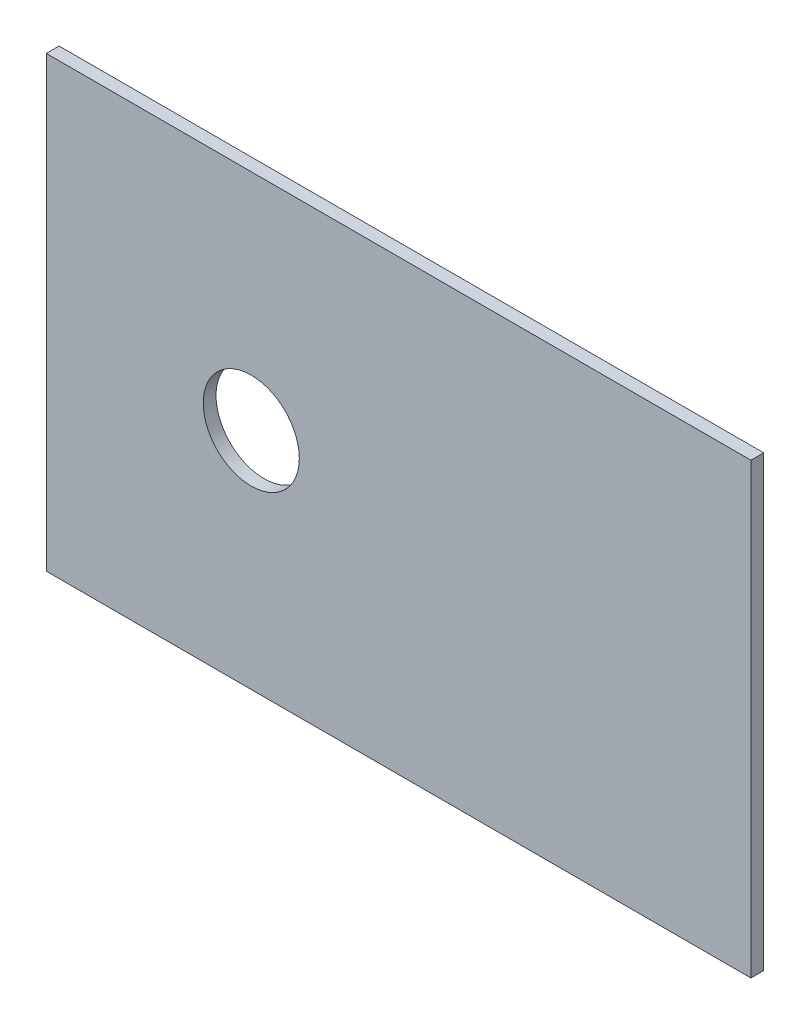
ISO-10303-21;
HEADER;
FILE_DESCRIPTION(('STEP AP214'),'2;1');
FILE_NAME('part.step','',(''),(''),'','','');
FILE_SCHEMA(('AUTOMOTIVE_DESIGN { 1 0 10303 214 1 1 1 1 }'));
ENDSEC;
DATA;
#1=APPLICATION_CONTEXT('core data for automotive mechanical design processes');
#2=APPLICATION_PROTOCOL_DEFINITION('international standard','automotive_design',2000,#1);
#3=PRODUCT_CONTEXT('',#1,'mechanical');
#4=PRODUCT('Part','Part','',(#3));
#5=PRODUCT_RELATED_PRODUCT_CATEGORY('part','',(#4));
#6=PRODUCT_DEFINITION_FORMATION('','',#4);
#7=PRODUCT_DEFINITION_CONTEXT('part definition',#1,'design');
#8=PRODUCT_DEFINITION('design','',#6,#7);
#9=PRODUCT_DEFINITION_SHAPE('','',#8);
#10=(LENGTH_UNIT() NAMED_UNIT(*) SI_UNIT(.MILLI.,.METRE.));
#11=(NAMED_UNIT(*) PLANE_ANGLE_UNIT() SI_UNIT($,.RADIAN.));
#12=(NAMED_UNIT(*) SI_UNIT($,.STERADIAN.) SOLID_ANGLE_UNIT());
#13=UNCERTAINTY_MEASURE_WITH_UNIT(LENGTH_MEASURE(1.E-05),#10,'distance_accuracy_value','');
#14=(GEOMETRIC_REPRESENTATION_CONTEXT(3) GLOBAL_UNCERTAINTY_ASSIGNED_CONTEXT((#13)) GLOBAL_UNIT_ASSIGNED_CONTEXT((#10,
#11,#12)) REPRESENTATION_CONTEXT('',''));
#15=CARTESIAN_POINT('',(0.,0.,0.));
#16=DIRECTION('',(0.,0.,1.));
#17=DIRECTION('',(1.,0.,0.));
#18=AXIS2_PLACEMENT_3D('',#15,#16,#17);
#19=CARTESIAN_POINT('',(-60.3966165413534,25.865507518797,2.54));
#20=DIRECTION('',(1.,0.,0.));
#21=DIRECTION('',(0.,1.,0.));
#22=AXIS2_PLACEMENT_3D('',#19,#20,#21);
#23=PLANE('',#22);
#24=DIRECTION('',(0.,-1.,0.));
#25=VECTOR('',#24,1.);
#26=CARTESIAN_POINT('',(-60.3966165413534,25.865507518797,0.));
#27=LINE('',#26,#25);
#28=CARTESIAN_POINT('',(-60.3966165413534,25.865507518797,0.));
#29=VERTEX_POINT('',#28);
#30=CARTESIAN_POINT('',(-60.3966165413534,-63.034492481203,0.));
#31=VERTEX_POINT('',#30);
#32=EDGE_CURVE('E125',#29,#31,#27,.T.);
#33=ORIENTED_EDGE('',*,*,#32,.T.);
#34=DIRECTION('',(0.,0.,-1.));
#35=VECTOR('',#34,1.);
#36=CARTESIAN_POINT('',(-60.3966165413534,-63.034492481203,2.54));
#37=LINE('',#36,#35);
#38=CARTESIAN_POINT('',(-60.3966165413534,-63.034492481203,2.54));
#39=VERTEX_POINT('',#38);
#40=EDGE_CURVE('E13',#39,#31,#37,.T.);
#41=ORIENTED_EDGE('',*,*,#40,.F.);
#42=DIRECTION('',(0.,-1.,0.));
#43=VECTOR('',#42,1.);
#44=CARTESIAN_POINT('',(-60.3966165413534,25.865507518797,2.54));
#45=LINE('',#44,#43);
#46=CARTESIAN_POINT('',(-60.3966165413534,25.865507518797,2.54));
#47=VERTEX_POINT('',#46);
#48=EDGE_CURVE('E109',#47,#39,#45,.T.);
#49=ORIENTED_EDGE('',*,*,#48,.F.);
#50=DIRECTION('',(0.,0.,-1.));
#51=VECTOR('',#50,1.);
#52=CARTESIAN_POINT('',(-60.3966165413534,25.865507518797,2.54));
#53=LINE('',#52,#51);
#54=EDGE_CURVE('E121',#47,#29,#53,.T.);
#55=ORIENTED_EDGE('',*,*,#54,.T.);
#56=EDGE_LOOP('',(#33,#41,#49,#55));
#57=FACE_BOUND('',#56,.T.);
#58=ADVANCED_FACE('F55',(#57),#23,.F.);
#59=CARTESIAN_POINT('',(-60.3966165413534,-63.034492481203,2.54));
#60=DIRECTION('',(0.,1.,0.));
#61=DIRECTION('',(0.,0.,1.));
#62=AXIS2_PLACEMENT_3D('',#59,#60,#61);
#63=PLANE('',#62);
#64=DIRECTION('',(1.,0.,0.));
#65=VECTOR('',#64,1.);
#66=CARTESIAN_POINT('',(-60.3966165413534,-63.034492481203,0.));
#67=LINE('',#66,#65);
#68=CARTESIAN_POINT('',(79.3033834586466,-63.034492481203,0.));
#69=VERTEX_POINT('',#68);
#70=EDGE_CURVE('E114',#31,#69,#67,.T.);
#71=ORIENTED_EDGE('',*,*,#70,.T.);
#72=DIRECTION('',(0.,0.,-1.));
#73=VECTOR('',#72,1.);
#74=CARTESIAN_POINT('',(79.3033834586466,-63.034492481203,2.54));
#75=LINE('',#74,#73);
#76=CARTESIAN_POINT('',(79.3033834586466,-63.034492481203,2.54));
#77=VERTEX_POINT('',#76);
#78=EDGE_CURVE('E64',#77,#69,#75,.T.);
#79=ORIENTED_EDGE('',*,*,#78,.F.);
#80=DIRECTION('',(1.,0.,0.));
#81=VECTOR('',#80,1.);
#82=CARTESIAN_POINT('',(-60.3966165413534,-63.034492481203,2.54));
#83=LINE('',#82,#81);
#84=EDGE_CURVE('E104',#39,#77,#83,.T.);
#85=ORIENTED_EDGE('',*,*,#84,.F.);
#86=ORIENTED_EDGE('',*,*,#40,.T.);
#87=EDGE_LOOP('',(#71,#79,#85,#86));
#88=FACE_BOUND('',#87,.T.);
#89=ADVANCED_FACE('F113',(#88),#63,.F.);
#90=CARTESIAN_POINT('',(79.3033834586466,25.865507518797,2.54));
#91=DIRECTION('',(-1.,0.,0.));
#92=DIRECTION('',(0.,0.,1.));
#93=AXIS2_PLACEMENT_3D('',#90,#91,#92);
#94=PLANE('',#93);
#95=DIRECTION('',(0.,1.,0.));
#96=VECTOR('',#95,1.);
#97=CARTESIAN_POINT('',(79.3033834586466,25.865507518797,0.));
#98=LINE('',#97,#96);
#99=CARTESIAN_POINT('',(79.3033834586466,25.865507518797,0.));
#100=VERTEX_POINT('',#99);
#101=EDGE_CURVE('E91',#69,#100,#98,.T.);
#102=ORIENTED_EDGE('',*,*,#101,.T.);
#103=DIRECTION('',(0.,0.,-1.));
#104=VECTOR('',#103,1.);
#105=CARTESIAN_POINT('',(79.3033834586466,25.865507518797,2.54));
#106=LINE('',#105,#104);
#107=CARTESIAN_POINT('',(79.3033834586466,25.865507518797,2.54));
#108=VERTEX_POINT('',#107);
#109=EDGE_CURVE('E116',#108,#100,#106,.T.);
#110=ORIENTED_EDGE('',*,*,#109,.F.);
#111=DIRECTION('',(0.,1.,0.));
#112=VECTOR('',#111,1.);
#113=CARTESIAN_POINT('',(79.3033834586466,25.865507518797,2.54));
#114=LINE('',#113,#112);
#115=EDGE_CURVE('E107',#77,#108,#114,.T.);
#116=ORIENTED_EDGE('',*,*,#115,.F.);
#117=ORIENTED_EDGE('',*,*,#78,.T.);
#118=EDGE_LOOP('',(#102,#110,#116,#117));
#119=FACE_BOUND('',#118,.T.);
#120=ADVANCED_FACE('F117',(#119),#94,.F.);
#121=CARTESIAN_POINT('',(-60.3966165413534,25.865507518797,2.54));
#122=DIRECTION('',(0.,-1.,0.));
#123=DIRECTION('',(0.,0.,-1.));
#124=AXIS2_PLACEMENT_3D('',#121,#122,#123);
#125=PLANE('',#124);
#126=DIRECTION('',(-1.,0.,0.));
#127=VECTOR('',#126,1.);
#128=CARTESIAN_POINT('',(-60.3966165413534,25.865507518797,0.));
#129=LINE('',#128,#127);
#130=EDGE_CURVE('E97',#100,#29,#129,.T.);
#131=ORIENTED_EDGE('',*,*,#130,.T.);
#132=ORIENTED_EDGE('',*,*,#54,.F.);
#133=DIRECTION('',(-1.,0.,0.));
#134=VECTOR('',#133,1.);
#135=CARTESIAN_POINT('',(-60.3966165413534,25.865507518797,2.54));
#136=LINE('',#135,#134);
#137=EDGE_CURVE('E74',#108,#47,#136,.T.);
#138=ORIENTED_EDGE('',*,*,#137,.F.);
#139=ORIENTED_EDGE('',*,*,#109,.T.);
#140=EDGE_LOOP('',(#131,#132,#138,#139));
#141=FACE_BOUND('',#140,.T.);
#142=ADVANCED_FACE('F139',(#141),#125,.F.);
#143=CARTESIAN_POINT('',(0.,0.,2.54));
#144=DIRECTION('',(0.,0.,1.));
#145=DIRECTION('',(1.,0.,0.));
#146=AXIS2_PLACEMENT_3D('',#143,#144,#145);
#147=PLANE('',#146);
#148=CARTESIAN_POINT('',(-19.7566165413534,-18.584492481203,2.54));
#149=DIRECTION('',(0.,0.,1.));
#150=DIRECTION('',(1.,0.,0.));
#151=AXIS2_PLACEMENT_3D('',#148,#149,#150);
#152=CIRCLE('',#151,9.525);
#153=CARTESIAN_POINT('',(-10.2316165413534,-18.584492481203,2.54));
#154=VERTEX_POINT('',#153);
#155=EDGE_CURVE('E146',#154,#154,#152,.T.);
#156=ORIENTED_EDGE('',*,*,#155,.F.);
#157=EDGE_LOOP('',(#156));
#158=FACE_BOUND('',#157,.T.);
#159=ORIENTED_EDGE('',*,*,#48,.T.);
#160=ORIENTED_EDGE('',*,*,#84,.T.);
#161=ORIENTED_EDGE('',*,*,#115,.T.);
#162=ORIENTED_EDGE('',*,*,#137,.T.);
#163=EDGE_LOOP('',(#159,#160,#161,#162));
#164=FACE_BOUND('',#163,.T.);
#165=ADVANCED_FACE('F105',(#158,#164),#147,.T.);
#166=CARTESIAN_POINT('',(0.,0.,0.));
#167=DIRECTION('',(0.,0.,1.));
#168=DIRECTION('',(1.,0.,0.));
#169=AXIS2_PLACEMENT_3D('',#166,#167,#168);
#170=PLANE('',#169);
#171=CARTESIAN_POINT('',(-19.7566165413534,-18.584492481203,0.));
#172=DIRECTION('',(0.,0.,1.));
#173=DIRECTION('',(1.,0.,0.));
#174=AXIS2_PLACEMENT_3D('',#171,#172,#173);
#175=CIRCLE('',#174,9.525);
#176=CARTESIAN_POINT('',(-10.2316165413534,-18.584492481203,0.));
#177=VERTEX_POINT('',#176);
#178=EDGE_CURVE('E129',#177,#177,#175,.T.);
#179=ORIENTED_EDGE('',*,*,#178,.T.);
#180=EDGE_LOOP('',(#179));
#181=FACE_BOUND('',#180,.T.);
#182=ORIENTED_EDGE('',*,*,#32,.F.);
#183=ORIENTED_EDGE('',*,*,#130,.F.);
#184=ORIENTED_EDGE('',*,*,#101,.F.);
#185=ORIENTED_EDGE('',*,*,#70,.F.);
#186=EDGE_LOOP('',(#182,#183,#184,#185));
#187=FACE_BOUND('',#186,.T.);
#188=ADVANCED_FACE('F142',(#181,#187),#170,.F.);
#189=CARTESIAN_POINT('',(-19.7566165413534,-18.584492481203,0.));
#190=DIRECTION('',(0.,0.,1.));
#191=DIRECTION('',(1.,0.,0.));
#192=AXIS2_PLACEMENT_3D('',#189,#190,#191);
#193=CYLINDRICAL_SURFACE('',#192,9.525);
#194=ORIENTED_EDGE('',*,*,#178,.F.);
#195=EDGE_LOOP('',(#194));
#196=FACE_BOUND('',#195,.T.);
#197=ORIENTED_EDGE('',*,*,#155,.T.);
#198=EDGE_LOOP('',(#197));
#199=FACE_BOUND('',#198,.T.);
#200=ADVANCED_FACE('F155',(#196,#199),#193,.F.);
#201=CLOSED_SHELL('',(#58,#89,#120,#142,#165,#188,#200));
#202=MANIFOLD_SOLID_BREP('B2',#201);
#203=ADVANCED_BREP_SHAPE_REPRESENTATION('',(#18,#202),#14);
#204=SHAPE_DEFINITION_REPRESENTATION(#9,#203);
ENDSEC;
END-ISO-10303-21;
